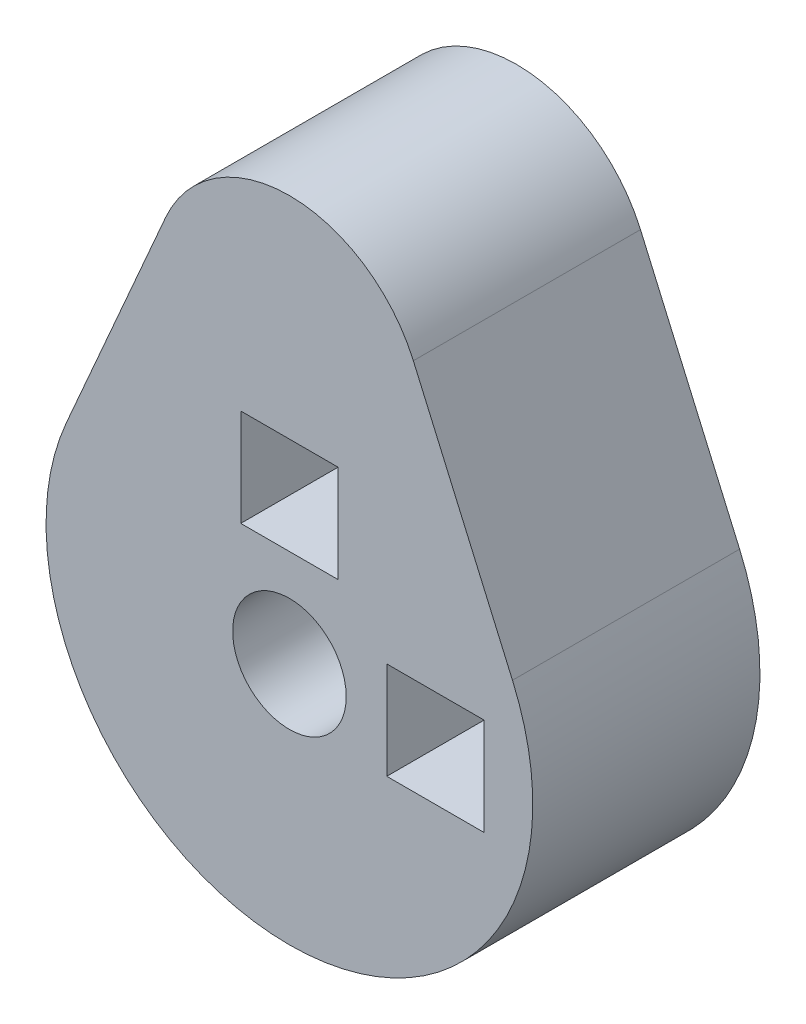
ISO-10303-21;
HEADER;
FILE_DESCRIPTION(('STEP AP214'),'2;1');
FILE_NAME('part.step','',(''),(''),'','','');
FILE_SCHEMA(('AUTOMOTIVE_DESIGN { 1 0 10303 214 1 1 1 1 }'));
ENDSEC;
DATA;
#1=APPLICATION_CONTEXT('core data for automotive mechanical design processes');
#2=APPLICATION_PROTOCOL_DEFINITION('international standard','automotive_design',2000,#1);
#3=PRODUCT_CONTEXT('',#1,'mechanical');
#4=PRODUCT('Part','Part','',(#3));
#5=PRODUCT_RELATED_PRODUCT_CATEGORY('part','',(#4));
#6=PRODUCT_DEFINITION_FORMATION('','',#4);
#7=PRODUCT_DEFINITION_CONTEXT('part definition',#1,'design');
#8=PRODUCT_DEFINITION('design','',#6,#7);
#9=PRODUCT_DEFINITION_SHAPE('','',#8);
#10=(LENGTH_UNIT() NAMED_UNIT(*) SI_UNIT(.MILLI.,.METRE.));
#11=(NAMED_UNIT(*) PLANE_ANGLE_UNIT() SI_UNIT($,.RADIAN.));
#12=(NAMED_UNIT(*) SI_UNIT($,.STERADIAN.) SOLID_ANGLE_UNIT());
#13=UNCERTAINTY_MEASURE_WITH_UNIT(LENGTH_MEASURE(1.E-05),#10,'distance_accuracy_value','');
#14=(GEOMETRIC_REPRESENTATION_CONTEXT(3) GLOBAL_UNCERTAINTY_ASSIGNED_CONTEXT((#13)) GLOBAL_UNIT_ASSIGNED_CONTEXT((#10,
#11,#12)) REPRESENTATION_CONTEXT('',''));
#15=CARTESIAN_POINT('',(0.,0.,0.));
#16=DIRECTION('',(0.,0.,1.));
#17=DIRECTION('',(1.,0.,0.));
#18=AXIS2_PLACEMENT_3D('',#15,#16,#17);
#19=CARTESIAN_POINT('',(0.,0.,7.));
#20=DIRECTION('',(0.,0.,1.));
#21=DIRECTION('',(1.,0.,0.));
#22=AXIS2_PLACEMENT_3D('',#19,#20,#21);
#23=PLANE('',#22);
#24=DIRECTION('',(0.,1.,0.));
#25=VECTOR('',#24,1.);
#26=CARTESIAN_POINT('',(1.5,3.,7.));
#27=LINE('',#26,#25);
#28=CARTESIAN_POINT('',(1.5,3.,7.));
#29=VERTEX_POINT('',#28);
#30=CARTESIAN_POINT('',(1.5,6.,7.));
#31=VERTEX_POINT('',#30);
#32=EDGE_CURVE('E54',#29,#31,#27,.T.);
#33=ORIENTED_EDGE('',*,*,#32,.F.);
#34=DIRECTION('',(1.,0.,0.));
#35=VECTOR('',#34,1.);
#36=CARTESIAN_POINT('',(-1.5,3.,7.));
#37=LINE('',#36,#35);
#38=CARTESIAN_POINT('',(-1.5,3.,7.));
#39=VERTEX_POINT('',#38);
#40=EDGE_CURVE('E149',#39,#29,#37,.T.);
#41=ORIENTED_EDGE('',*,*,#40,.F.);
#42=DIRECTION('',(0.,-1.,0.));
#43=VECTOR('',#42,1.);
#44=CARTESIAN_POINT('',(-1.5,3.,7.));
#45=LINE('',#44,#43);
#46=CARTESIAN_POINT('',(-1.5,6.,7.));
#47=VERTEX_POINT('',#46);
#48=EDGE_CURVE('E152',#47,#39,#45,.T.);
#49=ORIENTED_EDGE('',*,*,#48,.F.);
#50=DIRECTION('',(-1.,0.,0.));
#51=VECTOR('',#50,1.);
#52=CARTESIAN_POINT('',(-1.5,6.,7.));
#53=LINE('',#52,#51);
#54=EDGE_CURVE('E158',#31,#47,#53,.T.);
#55=ORIENTED_EDGE('',*,*,#54,.F.);
#56=EDGE_LOOP('',(#33,#41,#49,#55));
#57=FACE_BOUND('',#56,.T.);
#58=DIRECTION('',(0.,1.,0.));
#59=VECTOR('',#58,1.);
#60=CARTESIAN_POINT('',(6.,-1.5,7.));
#61=LINE('',#60,#59);
#62=CARTESIAN_POINT('',(6.,-1.5,7.));
#63=VERTEX_POINT('',#62);
#64=CARTESIAN_POINT('',(6.,1.5,7.));
#65=VERTEX_POINT('',#64);
#66=EDGE_CURVE('E62',#63,#65,#61,.T.);
#67=ORIENTED_EDGE('',*,*,#66,.F.);
#68=DIRECTION('',(1.,0.,0.));
#69=VECTOR('',#68,1.);
#70=CARTESIAN_POINT('',(3.,-1.5,7.));
#71=LINE('',#70,#69);
#72=CARTESIAN_POINT('',(3.,-1.5,7.));
#73=VERTEX_POINT('',#72);
#74=EDGE_CURVE('E177',#73,#63,#71,.T.);
#75=ORIENTED_EDGE('',*,*,#74,.F.);
#76=DIRECTION('',(0.,-1.,0.));
#77=VECTOR('',#76,1.);
#78=CARTESIAN_POINT('',(3.,-1.5,7.));
#79=LINE('',#78,#77);
#80=CARTESIAN_POINT('',(3.,1.5,7.));
#81=VERTEX_POINT('',#80);
#82=EDGE_CURVE('E180',#81,#73,#79,.T.);
#83=ORIENTED_EDGE('',*,*,#82,.F.);
#84=DIRECTION('',(-1.,0.,0.));
#85=VECTOR('',#84,1.);
#86=CARTESIAN_POINT('',(3.,1.5,7.));
#87=LINE('',#86,#85);
#88=EDGE_CURVE('E184',#65,#81,#87,.T.);
#89=ORIENTED_EDGE('',*,*,#88,.F.);
#90=EDGE_LOOP('',(#67,#75,#83,#89));
#91=FACE_BOUND('',#90,.T.);
#92=CARTESIAN_POINT('',(0.,0.,7.));
#93=DIRECTION('',(0.,0.,1.));
#94=DIRECTION('',(1.,0.,0.));
#95=AXIS2_PLACEMENT_3D('',#92,#93,#94);
#96=CIRCLE('',#95,7.5);
#97=CARTESIAN_POINT('',(-6.87386354243376,3.,7.));
#98=VERTEX_POINT('',#97);
#99=CARTESIAN_POINT('',(6.87386354243376,3.,7.));
#100=VERTEX_POINT('',#99);
#101=EDGE_CURVE('E204',#98,#100,#96,.T.);
#102=ORIENTED_EDGE('',*,*,#101,.T.);
#103=DIRECTION('',(-0.4,0.916515138991168,0.));
#104=VECTOR('',#103,1.);
#105=CARTESIAN_POINT('',(6.87386354243376,3.,7.));
#106=LINE('',#105,#104);
#107=CARTESIAN_POINT('',(3.81881307912987,10.,7.));
#108=VERTEX_POINT('',#107);
#109=EDGE_CURVE('E207',#100,#108,#106,.T.);
#110=ORIENTED_EDGE('',*,*,#109,.T.);
#111=CARTESIAN_POINT('',(0.,8.33333333333334,7.));
#112=DIRECTION('',(0.,0.,1.));
#113=DIRECTION('',(-1.,0.,0.));
#114=AXIS2_PLACEMENT_3D('',#111,#112,#113);
#115=CIRCLE('',#114,4.16666666666667);
#116=CARTESIAN_POINT('',(-3.81881307912987,10.,7.));
#117=VERTEX_POINT('',#116);
#118=EDGE_CURVE('E210',#108,#117,#115,.T.);
#119=ORIENTED_EDGE('',*,*,#118,.T.);
#120=DIRECTION('',(-0.4,-0.916515138991168,0.));
#121=VECTOR('',#120,1.);
#122=CARTESIAN_POINT('',(-6.87386354243376,3.,7.));
#123=LINE('',#122,#121);
#124=EDGE_CURVE('E212',#117,#98,#123,.T.);
#125=ORIENTED_EDGE('',*,*,#124,.T.);
#126=EDGE_LOOP('',(#102,#110,#119,#125));
#127=FACE_BOUND('',#126,.T.);
#128=CARTESIAN_POINT('',(0.,0.,7.));
#129=DIRECTION('',(0.,0.,1.));
#130=DIRECTION('',(1.,0.,0.));
#131=AXIS2_PLACEMENT_3D('',#128,#129,#130);
#132=CIRCLE('',#131,1.75);
#133=CARTESIAN_POINT('',(1.75,0.,7.));
#134=VERTEX_POINT('',#133);
#135=EDGE_CURVE('E198',#134,#134,#132,.T.);
#136=ORIENTED_EDGE('',*,*,#135,.F.);
#137=EDGE_LOOP('',(#136));
#138=FACE_BOUND('',#137,.T.);
#139=ADVANCED_FACE('F39',(#57,#91,#127,#138),#23,.T.);
#140=CARTESIAN_POINT('',(0.,0.,0.));
#141=DIRECTION('',(0.,0.,1.));
#142=DIRECTION('',(1.,0.,0.));
#143=AXIS2_PLACEMENT_3D('',#140,#141,#142);
#144=PLANE('',#143);
#145=DIRECTION('',(1.,0.,0.));
#146=VECTOR('',#145,1.);
#147=CARTESIAN_POINT('',(-1.5,3.,0.));
#148=LINE('',#147,#146);
#149=CARTESIAN_POINT('',(-1.5,3.,0.));
#150=VERTEX_POINT('',#149);
#151=CARTESIAN_POINT('',(1.5,3.,0.));
#152=VERTEX_POINT('',#151);
#153=EDGE_CURVE('E136',#150,#152,#148,.T.);
#154=ORIENTED_EDGE('',*,*,#153,.T.);
#155=DIRECTION('',(0.,1.,0.));
#156=VECTOR('',#155,1.);
#157=CARTESIAN_POINT('',(1.5,3.,0.));
#158=LINE('',#157,#156);
#159=CARTESIAN_POINT('',(1.5,6.,0.));
#160=VERTEX_POINT('',#159);
#161=EDGE_CURVE('E130',#152,#160,#158,.T.);
#162=ORIENTED_EDGE('',*,*,#161,.T.);
#163=DIRECTION('',(-1.,0.,0.));
#164=VECTOR('',#163,1.);
#165=CARTESIAN_POINT('',(-1.5,6.,0.));
#166=LINE('',#165,#164);
#167=CARTESIAN_POINT('',(-1.5,6.,0.));
#168=VERTEX_POINT('',#167);
#169=EDGE_CURVE('E140',#160,#168,#166,.T.);
#170=ORIENTED_EDGE('',*,*,#169,.T.);
#171=DIRECTION('',(0.,-1.,0.));
#172=VECTOR('',#171,1.);
#173=CARTESIAN_POINT('',(-1.5,3.,0.));
#174=LINE('',#173,#172);
#175=EDGE_CURVE('E144',#168,#150,#174,.T.);
#176=ORIENTED_EDGE('',*,*,#175,.T.);
#177=EDGE_LOOP('',(#154,#162,#170,#176));
#178=FACE_BOUND('',#177,.T.);
#179=DIRECTION('',(1.,0.,0.));
#180=VECTOR('',#179,1.);
#181=CARTESIAN_POINT('',(3.,-1.5,0.));
#182=LINE('',#181,#180);
#183=CARTESIAN_POINT('',(3.,-1.5,0.));
#184=VERTEX_POINT('',#183);
#185=CARTESIAN_POINT('',(6.,-1.5,0.));
#186=VERTEX_POINT('',#185);
#187=EDGE_CURVE('E170',#184,#186,#182,.T.);
#188=ORIENTED_EDGE('',*,*,#187,.T.);
#189=DIRECTION('',(0.,1.,0.));
#190=VECTOR('',#189,1.);
#191=CARTESIAN_POINT('',(6.,-1.5,0.));
#192=LINE('',#191,#190);
#193=CARTESIAN_POINT('',(6.,1.5,0.));
#194=VERTEX_POINT('',#193);
#195=EDGE_CURVE('E181',#186,#194,#192,.T.);
#196=ORIENTED_EDGE('',*,*,#195,.T.);
#197=DIRECTION('',(-1.,0.,0.));
#198=VECTOR('',#197,1.);
#199=CARTESIAN_POINT('',(3.,1.5,0.));
#200=LINE('',#199,#198);
#201=CARTESIAN_POINT('',(3.,1.5,0.));
#202=VERTEX_POINT('',#201);
#203=EDGE_CURVE('E193',#194,#202,#200,.T.);
#204=ORIENTED_EDGE('',*,*,#203,.T.);
#205=DIRECTION('',(0.,-1.,0.));
#206=VECTOR('',#205,1.);
#207=CARTESIAN_POINT('',(3.,-1.5,0.));
#208=LINE('',#207,#206);
#209=EDGE_CURVE('E190',#202,#184,#208,.T.);
#210=ORIENTED_EDGE('',*,*,#209,.T.);
#211=EDGE_LOOP('',(#188,#196,#204,#210));
#212=FACE_BOUND('',#211,.T.);
#213=CARTESIAN_POINT('',(0.,0.,0.));
#214=DIRECTION('',(0.,0.,1.));
#215=DIRECTION('',(1.,0.,0.));
#216=AXIS2_PLACEMENT_3D('',#213,#214,#215);
#217=CIRCLE('',#216,7.5);
#218=CARTESIAN_POINT('',(-6.87386354243376,3.,0.));
#219=VERTEX_POINT('',#218);
#220=CARTESIAN_POINT('',(6.87386354243376,3.,0.));
#221=VERTEX_POINT('',#220);
#222=EDGE_CURVE('E201',#219,#221,#217,.T.);
#223=ORIENTED_EDGE('',*,*,#222,.F.);
#224=DIRECTION('',(-0.4,-0.916515138991168,0.));
#225=VECTOR('',#224,1.);
#226=CARTESIAN_POINT('',(-6.87386354243376,3.,0.));
#227=LINE('',#226,#225);
#228=CARTESIAN_POINT('',(-3.81881307912987,10.,0.));
#229=VERTEX_POINT('',#228);
#230=EDGE_CURVE('E208',#229,#219,#227,.T.);
#231=ORIENTED_EDGE('',*,*,#230,.F.);
#232=CARTESIAN_POINT('',(0.,8.33333333333334,0.));
#233=DIRECTION('',(0.,0.,1.));
#234=DIRECTION('',(-1.,0.,0.));
#235=AXIS2_PLACEMENT_3D('',#232,#233,#234);
#236=CIRCLE('',#235,4.16666666666667);
#237=CARTESIAN_POINT('',(3.81881307912987,10.,0.));
#238=VERTEX_POINT('',#237);
#239=EDGE_CURVE('E219',#238,#229,#236,.T.);
#240=ORIENTED_EDGE('',*,*,#239,.F.);
#241=DIRECTION('',(-0.4,0.916515138991168,0.));
#242=VECTOR('',#241,1.);
#243=CARTESIAN_POINT('',(6.87386354243376,3.,0.));
#244=LINE('',#243,#242);
#245=EDGE_CURVE('E217',#221,#238,#244,.T.);
#246=ORIENTED_EDGE('',*,*,#245,.F.);
#247=EDGE_LOOP('',(#223,#231,#240,#246));
#248=FACE_BOUND('',#247,.T.);
#249=CARTESIAN_POINT('',(0.,0.,0.));
#250=DIRECTION('',(0.,0.,1.));
#251=DIRECTION('',(1.,0.,0.));
#252=AXIS2_PLACEMENT_3D('',#249,#250,#251);
#253=CIRCLE('',#252,1.75);
#254=CARTESIAN_POINT('',(1.75,0.,0.));
#255=VERTEX_POINT('',#254);
#256=EDGE_CURVE('E164',#255,#255,#253,.T.);
#257=ORIENTED_EDGE('',*,*,#256,.T.);
#258=EDGE_LOOP('',(#257));
#259=FACE_BOUND('',#258,.T.);
#260=ADVANCED_FACE('F146',(#178,#212,#248,#259),#144,.F.);
#261=CARTESIAN_POINT('',(0.,0.,7.));
#262=DIRECTION('',(0.,0.,-1.));
#263=DIRECTION('',(-1.,0.,0.));
#264=AXIS2_PLACEMENT_3D('',#261,#262,#263);
#265=CYLINDRICAL_SURFACE('',#264,7.5);
#266=ORIENTED_EDGE('',*,*,#222,.T.);
#267=DIRECTION('',(0.,0.,-1.));
#268=VECTOR('',#267,1.);
#269=CARTESIAN_POINT('',(6.87386354243376,3.,7.));
#270=LINE('',#269,#268);
#271=EDGE_CURVE('E11',#100,#221,#270,.T.);
#272=ORIENTED_EDGE('',*,*,#271,.F.);
#273=ORIENTED_EDGE('',*,*,#101,.F.);
#274=DIRECTION('',(0.,0.,-1.));
#275=VECTOR('',#274,1.);
#276=CARTESIAN_POINT('',(-6.87386354243376,3.,7.));
#277=LINE('',#276,#275);
#278=EDGE_CURVE('E214',#98,#219,#277,.T.);
#279=ORIENTED_EDGE('',*,*,#278,.T.);
#280=EDGE_LOOP('',(#266,#272,#273,#279));
#281=FACE_BOUND('',#280,.T.);
#282=ADVANCED_FACE('F41',(#281),#265,.T.);
#283=CARTESIAN_POINT('',(6.87386354243376,3.,7.));
#284=DIRECTION('',(-0.916515138991168,-0.4,0.));
#285=DIRECTION('',(0.4,-0.916515138991168,0.));
#286=AXIS2_PLACEMENT_3D('',#283,#284,#285);
#287=PLANE('',#286);
#288=ORIENTED_EDGE('',*,*,#245,.T.);
#289=DIRECTION('',(0.,0.,-1.));
#290=VECTOR('',#289,1.);
#291=CARTESIAN_POINT('',(3.81881307912987,10.,7.));
#292=LINE('',#291,#290);
#293=EDGE_CURVE('E47',#108,#238,#292,.T.);
#294=ORIENTED_EDGE('',*,*,#293,.F.);
#295=ORIENTED_EDGE('',*,*,#109,.F.);
#296=ORIENTED_EDGE('',*,*,#271,.T.);
#297=EDGE_LOOP('',(#288,#294,#295,#296));
#298=FACE_BOUND('',#297,.T.);
#299=ADVANCED_FACE('F247',(#298),#287,.F.);
#300=CARTESIAN_POINT('',(0.,8.33333333333334,7.));
#301=DIRECTION('',(0.,0.,-1.));
#302=DIRECTION('',(-1.,0.,0.));
#303=AXIS2_PLACEMENT_3D('',#300,#301,#302);
#304=CYLINDRICAL_SURFACE('',#303,4.16666666666667);
#305=ORIENTED_EDGE('',*,*,#239,.T.);
#306=DIRECTION('',(0.,0.,-1.));
#307=VECTOR('',#306,1.);
#308=CARTESIAN_POINT('',(-3.81881307912987,10.,7.));
#309=LINE('',#308,#307);
#310=EDGE_CURVE('E224',#117,#229,#309,.T.);
#311=ORIENTED_EDGE('',*,*,#310,.F.);
#312=ORIENTED_EDGE('',*,*,#118,.F.);
#313=ORIENTED_EDGE('',*,*,#293,.T.);
#314=EDGE_LOOP('',(#305,#311,#312,#313));
#315=FACE_BOUND('',#314,.T.);
#316=ADVANCED_FACE('F231',(#315),#304,.T.);
#317=CARTESIAN_POINT('',(-6.87386354243376,3.,7.));
#318=DIRECTION('',(0.916515138991168,-0.4,0.));
#319=DIRECTION('',(0.4,0.916515138991168,0.));
#320=AXIS2_PLACEMENT_3D('',#317,#318,#319);
#321=PLANE('',#320);
#322=ORIENTED_EDGE('',*,*,#230,.T.);
#323=ORIENTED_EDGE('',*,*,#278,.F.);
#324=ORIENTED_EDGE('',*,*,#124,.F.);
#325=ORIENTED_EDGE('',*,*,#310,.T.);
#326=EDGE_LOOP('',(#322,#323,#324,#325));
#327=FACE_BOUND('',#326,.T.);
#328=ADVANCED_FACE('F240',(#327),#321,.F.);
#329=CARTESIAN_POINT('',(0.,0.,7.));
#330=DIRECTION('',(0.,0.,-1.));
#331=DIRECTION('',(-1.,0.,0.));
#332=AXIS2_PLACEMENT_3D('',#329,#330,#331);
#333=CYLINDRICAL_SURFACE('',#332,1.75);
#334=ORIENTED_EDGE('',*,*,#135,.T.);
#335=EDGE_LOOP('',(#334));
#336=FACE_BOUND('',#335,.T.);
#337=ORIENTED_EDGE('',*,*,#256,.F.);
#338=EDGE_LOOP('',(#337));
#339=FACE_BOUND('',#338,.T.);
#340=ADVANCED_FACE('F264',(#336,#339),#333,.F.);
#341=CARTESIAN_POINT('',(6.,-1.5,0.));
#342=DIRECTION('',(1.,0.,0.));
#343=DIRECTION('',(0.,0.,-1.));
#344=AXIS2_PLACEMENT_3D('',#341,#342,#343);
#345=PLANE('',#344);
#346=ORIENTED_EDGE('',*,*,#66,.T.);
#347=DIRECTION('',(0.,0.,1.));
#348=VECTOR('',#347,1.);
#349=CARTESIAN_POINT('',(6.,1.5,0.));
#350=LINE('',#349,#348);
#351=EDGE_CURVE('E168',#194,#65,#350,.T.);
#352=ORIENTED_EDGE('',*,*,#351,.F.);
#353=ORIENTED_EDGE('',*,*,#195,.F.);
#354=DIRECTION('',(0.,0.,1.));
#355=VECTOR('',#354,1.);
#356=CARTESIAN_POINT('',(6.,-1.5,0.));
#357=LINE('',#356,#355);
#358=EDGE_CURVE('E175',#186,#63,#357,.T.);
#359=ORIENTED_EDGE('',*,*,#358,.T.);
#360=EDGE_LOOP('',(#346,#352,#353,#359));
#361=FACE_BOUND('',#360,.T.);
#362=ADVANCED_FACE('F270',(#361),#345,.F.);
#363=CARTESIAN_POINT('',(3.,-1.5,0.));
#364=DIRECTION('',(0.,-1.,0.));
#365=DIRECTION('',(0.,0.,-1.));
#366=AXIS2_PLACEMENT_3D('',#363,#364,#365);
#367=PLANE('',#366);
#368=ORIENTED_EDGE('',*,*,#74,.T.);
#369=ORIENTED_EDGE('',*,*,#358,.F.);
#370=ORIENTED_EDGE('',*,*,#187,.F.);
#371=DIRECTION('',(0.,0.,1.));
#372=VECTOR('',#371,1.);
#373=CARTESIAN_POINT('',(3.,-1.5,0.));
#374=LINE('',#373,#372);
#375=EDGE_CURVE('E173',#184,#73,#374,.T.);
#376=ORIENTED_EDGE('',*,*,#375,.T.);
#377=EDGE_LOOP('',(#368,#369,#370,#376));
#378=FACE_BOUND('',#377,.T.);
#379=ADVANCED_FACE('F275',(#378),#367,.F.);
#380=CARTESIAN_POINT('',(3.,-1.5,0.));
#381=DIRECTION('',(-1.,0.,0.));
#382=DIRECTION('',(0.,0.,1.));
#383=AXIS2_PLACEMENT_3D('',#380,#381,#382);
#384=PLANE('',#383);
#385=ORIENTED_EDGE('',*,*,#82,.T.);
#386=ORIENTED_EDGE('',*,*,#375,.F.);
#387=ORIENTED_EDGE('',*,*,#209,.F.);
#388=DIRECTION('',(0.,0.,1.));
#389=VECTOR('',#388,1.);
#390=CARTESIAN_POINT('',(3.,1.5,0.));
#391=LINE('',#390,#389);
#392=EDGE_CURVE('E171',#202,#81,#391,.T.);
#393=ORIENTED_EDGE('',*,*,#392,.T.);
#394=EDGE_LOOP('',(#385,#386,#387,#393));
#395=FACE_BOUND('',#394,.T.);
#396=ADVANCED_FACE('F283',(#395),#384,.F.);
#397=CARTESIAN_POINT('',(3.,1.5,0.));
#398=DIRECTION('',(0.,1.,0.));
#399=DIRECTION('',(0.,0.,1.));
#400=AXIS2_PLACEMENT_3D('',#397,#398,#399);
#401=PLANE('',#400);
#402=ORIENTED_EDGE('',*,*,#88,.T.);
#403=ORIENTED_EDGE('',*,*,#392,.F.);
#404=ORIENTED_EDGE('',*,*,#203,.F.);
#405=ORIENTED_EDGE('',*,*,#351,.T.);
#406=EDGE_LOOP('',(#402,#403,#404,#405));
#407=FACE_BOUND('',#406,.T.);
#408=ADVANCED_FACE('F288',(#407),#401,.F.);
#409=CARTESIAN_POINT('',(1.5,3.,0.));
#410=DIRECTION('',(1.,0.,0.));
#411=DIRECTION('',(0.,0.,-1.));
#412=AXIS2_PLACEMENT_3D('',#409,#410,#411);
#413=PLANE('',#412);
#414=ORIENTED_EDGE('',*,*,#32,.T.);
#415=DIRECTION('',(0.,0.,1.));
#416=VECTOR('',#415,1.);
#417=CARTESIAN_POINT('',(1.5,6.,0.));
#418=LINE('',#417,#416);
#419=EDGE_CURVE('E126',#160,#31,#418,.T.);
#420=ORIENTED_EDGE('',*,*,#419,.F.);
#421=ORIENTED_EDGE('',*,*,#161,.F.);
#422=DIRECTION('',(0.,0.,1.));
#423=VECTOR('',#422,1.);
#424=CARTESIAN_POINT('',(1.5,3.,0.));
#425=LINE('',#424,#423);
#426=EDGE_CURVE('E162',#152,#29,#425,.T.);
#427=ORIENTED_EDGE('',*,*,#426,.T.);
#428=EDGE_LOOP('',(#414,#420,#421,#427));
#429=FACE_BOUND('',#428,.T.);
#430=ADVANCED_FACE('F128',(#429),#413,.F.);
#431=CARTESIAN_POINT('',(-1.5,3.,0.));
#432=DIRECTION('',(0.,-1.,0.));
#433=DIRECTION('',(0.,0.,-1.));
#434=AXIS2_PLACEMENT_3D('',#431,#432,#433);
#435=PLANE('',#434);
#436=ORIENTED_EDGE('',*,*,#40,.T.);
#437=ORIENTED_EDGE('',*,*,#426,.F.);
#438=ORIENTED_EDGE('',*,*,#153,.F.);
#439=DIRECTION('',(0.,0.,1.));
#440=VECTOR('',#439,1.);
#441=CARTESIAN_POINT('',(-1.5,3.,0.));
#442=LINE('',#441,#440);
#443=EDGE_CURVE('E165',#150,#39,#442,.T.);
#444=ORIENTED_EDGE('',*,*,#443,.T.);
#445=EDGE_LOOP('',(#436,#437,#438,#444));
#446=FACE_BOUND('',#445,.T.);
#447=ADVANCED_FACE('F317',(#446),#435,.F.);
#448=CARTESIAN_POINT('',(-1.5,3.,0.));
#449=DIRECTION('',(-1.,0.,0.));
#450=DIRECTION('',(0.,0.,1.));
#451=AXIS2_PLACEMENT_3D('',#448,#449,#450);
#452=PLANE('',#451);
#453=ORIENTED_EDGE('',*,*,#48,.T.);
#454=ORIENTED_EDGE('',*,*,#443,.F.);
#455=ORIENTED_EDGE('',*,*,#175,.F.);
#456=DIRECTION('',(0.,0.,1.));
#457=VECTOR('',#456,1.);
#458=CARTESIAN_POINT('',(-1.5,6.,0.));
#459=LINE('',#458,#457);
#460=EDGE_CURVE('E135',#168,#47,#459,.T.);
#461=ORIENTED_EDGE('',*,*,#460,.T.);
#462=EDGE_LOOP('',(#453,#454,#455,#461));
#463=FACE_BOUND('',#462,.T.);
#464=ADVANCED_FACE('F324',(#463),#452,.F.);
#465=CARTESIAN_POINT('',(-1.5,6.,0.));
#466=DIRECTION('',(0.,1.,0.));
#467=DIRECTION('',(0.,0.,1.));
#468=AXIS2_PLACEMENT_3D('',#465,#466,#467);
#469=PLANE('',#468);
#470=ORIENTED_EDGE('',*,*,#54,.T.);
#471=ORIENTED_EDGE('',*,*,#460,.F.);
#472=ORIENTED_EDGE('',*,*,#169,.F.);
#473=ORIENTED_EDGE('',*,*,#419,.T.);
#474=EDGE_LOOP('',(#470,#471,#472,#473));
#475=FACE_BOUND('',#474,.T.);
#476=ADVANCED_FACE('F141',(#475),#469,.F.);
#477=CLOSED_SHELL('',(#139,#260,#282,#299,#316,#328,#340,#362,#379,#396,#408,#430,#447,#464,#476));
#478=MANIFOLD_SOLID_BREP('B2',#477);
#479=ADVANCED_BREP_SHAPE_REPRESENTATION('',(#18,#478),#14);
#480=SHAPE_DEFINITION_REPRESENTATION(#9,#479);
ENDSEC;
END-ISO-10303-21;
